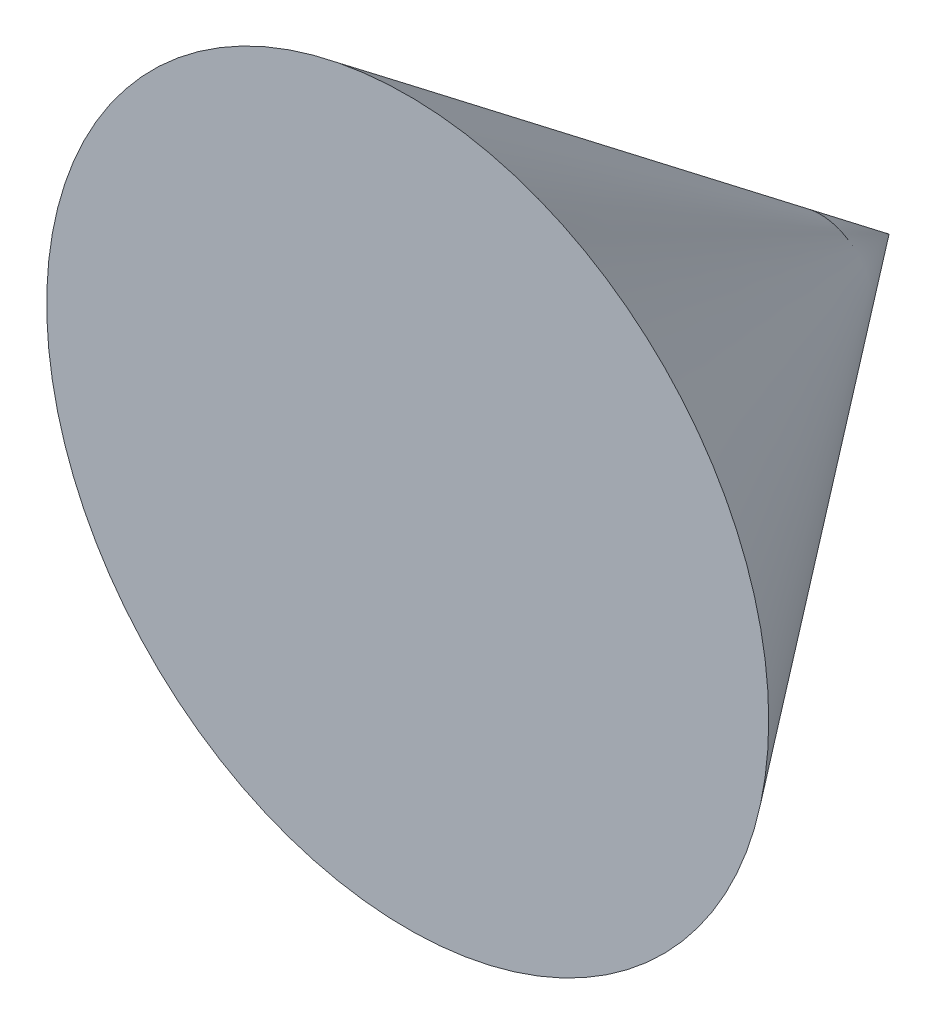
ISO-10303-21;
HEADER;
FILE_DESCRIPTION(('STEP AP214'),'2;1');
FILE_NAME('part.step','',(''),(''),'','','');
FILE_SCHEMA(('AUTOMOTIVE_DESIGN { 1 0 10303 214 1 1 1 1 }'));
ENDSEC;
DATA;
#1=APPLICATION_CONTEXT('core data for automotive mechanical design processes');
#2=APPLICATION_PROTOCOL_DEFINITION('international standard','automotive_design',2000,#1);
#3=PRODUCT_CONTEXT('',#1,'mechanical');
#4=PRODUCT('Part','Part','',(#3));
#5=PRODUCT_RELATED_PRODUCT_CATEGORY('part','',(#4));
#6=PRODUCT_DEFINITION_FORMATION('','',#4);
#7=PRODUCT_DEFINITION_CONTEXT('part definition',#1,'design');
#8=PRODUCT_DEFINITION('design','',#6,#7);
#9=PRODUCT_DEFINITION_SHAPE('','',#8);
#10=(LENGTH_UNIT() NAMED_UNIT(*) SI_UNIT(.MILLI.,.METRE.));
#11=(NAMED_UNIT(*) PLANE_ANGLE_UNIT() SI_UNIT($,.RADIAN.));
#12=(NAMED_UNIT(*) SI_UNIT($,.STERADIAN.) SOLID_ANGLE_UNIT());
#13=UNCERTAINTY_MEASURE_WITH_UNIT(LENGTH_MEASURE(1.E-05),#10,'distance_accuracy_value','');
#14=(GEOMETRIC_REPRESENTATION_CONTEXT(3) GLOBAL_UNCERTAINTY_ASSIGNED_CONTEXT((#13)) GLOBAL_UNIT_ASSIGNED_CONTEXT((#10,
#11,#12)) REPRESENTATION_CONTEXT('',''));
#15=CARTESIAN_POINT('',(0.,0.,0.));
#16=DIRECTION('',(0.,0.,1.));
#17=DIRECTION('',(1.,0.,0.));
#18=AXIS2_PLACEMENT_3D('',#15,#16,#17);
#19=CARTESIAN_POINT('',(0.,0.,0.));
#20=DIRECTION('',(0.,0.,1.));
#21=DIRECTION('',(1.,0.,0.));
#22=AXIS2_PLACEMENT_3D('',#19,#20,#21);
#23=CONICAL_SURFACE('',#22,150.,0.643501108793284);
#24=CARTESIAN_POINT('',(0.,0.,-200.));
#25=VERTEX_POINT('',#24);
#26=VERTEX_LOOP('',#25);
#27=FACE_BOUND('',#26,.T.);
#28=CARTESIAN_POINT('',(0.,0.,0.));
#29=DIRECTION('',(0.,0.,1.));
#30=DIRECTION('',(1.,0.,0.));
#31=AXIS2_PLACEMENT_3D('',#28,#29,#30);
#32=CIRCLE('',#31,150.);
#33=CARTESIAN_POINT('',(150.,0.,0.));
#34=VERTEX_POINT('',#33);
#35=EDGE_CURVE('E11',#34,#34,#32,.T.);
#36=ORIENTED_EDGE('',*,*,#35,.F.);
#37=EDGE_LOOP('',(#36));
#38=FACE_BOUND('',#37,.T.);
#39=ADVANCED_FACE('F41',(#27,#38),#23,.T.);
#40=CARTESIAN_POINT('',(0.,0.,0.));
#41=DIRECTION('',(0.,0.,1.));
#42=DIRECTION('',(1.,0.,0.));
#43=AXIS2_PLACEMENT_3D('',#40,#41,#42);
#44=PLANE('',#43);
#45=ORIENTED_EDGE('',*,*,#35,.T.);
#46=EDGE_LOOP('',(#45));
#47=FACE_BOUND('',#46,.T.);
#48=ADVANCED_FACE('F50',(#47),#44,.T.);
#49=CLOSED_SHELL('',(#39,#48));
#50=MANIFOLD_SOLID_BREP('B2',#49);
#51=ADVANCED_BREP_SHAPE_REPRESENTATION('',(#18,#50),#14);
#52=SHAPE_DEFINITION_REPRESENTATION(#9,#51);
ENDSEC;
END-ISO-10303-21;
